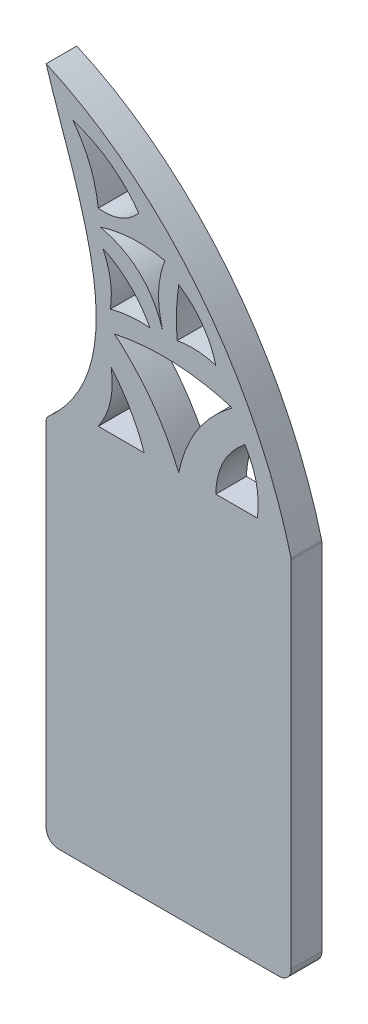
ISO-10303-21;
HEADER;
FILE_DESCRIPTION(('STEP AP214'),'2;1');
FILE_NAME('part.step','',(''),(''),'','','');
FILE_SCHEMA(('AUTOMOTIVE_DESIGN { 1 0 10303 214 1 1 1 1 }'));
ENDSEC;
DATA;
#1=APPLICATION_CONTEXT('core data for automotive mechanical design processes');
#2=APPLICATION_PROTOCOL_DEFINITION('international standard','automotive_design',2000,#1);
#3=PRODUCT_CONTEXT('',#1,'mechanical');
#4=PRODUCT('Part','Part','',(#3));
#5=PRODUCT_RELATED_PRODUCT_CATEGORY('part','',(#4));
#6=PRODUCT_DEFINITION_FORMATION('','',#4);
#7=PRODUCT_DEFINITION_CONTEXT('part definition',#1,'design');
#8=PRODUCT_DEFINITION('design','',#6,#7);
#9=PRODUCT_DEFINITION_SHAPE('','',#8);
#10=(LENGTH_UNIT() NAMED_UNIT(*) SI_UNIT(.MILLI.,.METRE.));
#11=(NAMED_UNIT(*) PLANE_ANGLE_UNIT() SI_UNIT($,.RADIAN.));
#12=(NAMED_UNIT(*) SI_UNIT($,.STERADIAN.) SOLID_ANGLE_UNIT());
#13=UNCERTAINTY_MEASURE_WITH_UNIT(LENGTH_MEASURE(1.E-05),#10,'distance_accuracy_value','');
#14=(GEOMETRIC_REPRESENTATION_CONTEXT(3) GLOBAL_UNCERTAINTY_ASSIGNED_CONTEXT((#13)) GLOBAL_UNIT_ASSIGNED_CONTEXT((#10,
#11,#12)) REPRESENTATION_CONTEXT('',''));
#15=CARTESIAN_POINT('',(0.,0.,0.));
#16=DIRECTION('',(0.,0.,1.));
#17=DIRECTION('',(1.,0.,0.));
#18=AXIS2_PLACEMENT_3D('',#15,#16,#17);
#19=CARTESIAN_POINT('',(0.,0.,12.7));
#20=DIRECTION('',(-1.,0.,0.));
#21=DIRECTION('',(0.,0.,1.));
#22=AXIS2_PLACEMENT_3D('',#19,#20,#21);
#23=PLANE('',#22);
#24=DIRECTION('',(0.,1.,0.));
#25=VECTOR('',#24,1.);
#26=CARTESIAN_POINT('',(0.,0.,0.));
#27=LINE('',#26,#25);
#28=CARTESIAN_POINT('',(0.,5.08,0.));
#29=VERTEX_POINT('',#28);
#30=CARTESIAN_POINT('',(0.,151.251284081008,0.));
#31=VERTEX_POINT('',#30);
#32=EDGE_CURVE('E384',#29,#31,#27,.T.);
#33=ORIENTED_EDGE('',*,*,#32,.F.);
#34=DIRECTION('',(0.,0.,-1.));
#35=VECTOR('',#34,1.);
#36=CARTESIAN_POINT('',(0.,5.08,12.7));
#37=LINE('',#36,#35);
#38=CARTESIAN_POINT('',(0.,5.08,12.7));
#39=VERTEX_POINT('',#38);
#40=EDGE_CURVE('E11',#29,#39,#37,.F.);
#41=ORIENTED_EDGE('',*,*,#40,.T.);
#42=DIRECTION('',(0.,1.,0.));
#43=VECTOR('',#42,1.);
#44=CARTESIAN_POINT('',(0.,0.,12.7));
#45=LINE('',#44,#43);
#46=CARTESIAN_POINT('',(0.,151.251284081008,12.7));
#47=VERTEX_POINT('',#46);
#48=EDGE_CURVE('E383',#39,#47,#45,.T.);
#49=ORIENTED_EDGE('',*,*,#48,.T.);
#50=DIRECTION('',(0.,0.,-1.));
#51=VECTOR('',#50,1.);
#52=CARTESIAN_POINT('',(0.,151.251284081008,12.7));
#53=LINE('',#52,#51);
#54=EDGE_CURVE('E357',#47,#31,#53,.T.);
#55=ORIENTED_EDGE('',*,*,#54,.T.);
#56=EDGE_LOOP('',(#33,#41,#49,#55));
#57=FACE_BOUND('',#56,.T.);
#58=ADVANCED_FACE('F45',(#57),#23,.T.);
#59=CARTESIAN_POINT('',(0.,0.,12.7));
#60=DIRECTION('',(0.,1.,0.));
#61=DIRECTION('',(0.,0.,1.));
#62=AXIS2_PLACEMENT_3D('',#59,#60,#61);
#63=PLANE('',#62);
#64=DIRECTION('',(1.,0.,0.));
#65=VECTOR('',#64,1.);
#66=CARTESIAN_POINT('',(0.,0.,0.));
#67=LINE('',#66,#65);
#68=CARTESIAN_POINT('',(5.08,0.,0.));
#69=VERTEX_POINT('',#68);
#70=CARTESIAN_POINT('',(96.52,0.,0.));
#71=VERTEX_POINT('',#70);
#72=EDGE_CURVE('E388',#69,#71,#67,.T.);
#73=ORIENTED_EDGE('',*,*,#72,.T.);
#74=DIRECTION('',(0.,0.,-1.));
#75=VECTOR('',#74,1.);
#76=CARTESIAN_POINT('',(96.52,0.,12.7));
#77=LINE('',#76,#75);
#78=CARTESIAN_POINT('',(96.52,0.,12.7));
#79=VERTEX_POINT('',#78);
#80=EDGE_CURVE('E67',#71,#79,#77,.F.);
#81=ORIENTED_EDGE('',*,*,#80,.T.);
#82=DIRECTION('',(1.,0.,0.));
#83=VECTOR('',#82,1.);
#84=CARTESIAN_POINT('',(0.,0.,12.7));
#85=LINE('',#84,#83);
#86=CARTESIAN_POINT('',(5.08,0.,12.7));
#87=VERTEX_POINT('',#86);
#88=EDGE_CURVE('E397',#87,#79,#85,.T.);
#89=ORIENTED_EDGE('',*,*,#88,.F.);
#90=DIRECTION('',(0.,0.,-1.));
#91=VECTOR('',#90,1.);
#92=CARTESIAN_POINT('',(5.08,0.,0.));
#93=LINE('',#92,#91);
#94=EDGE_CURVE('E342',#87,#69,#93,.T.);
#95=ORIENTED_EDGE('',*,*,#94,.T.);
#96=EDGE_LOOP('',(#73,#81,#89,#95));
#97=FACE_BOUND('',#96,.T.);
#98=ADVANCED_FACE('F309',(#97),#63,.F.);
#99=CARTESIAN_POINT('',(101.6,0.,12.7));
#100=DIRECTION('',(-1.,0.,0.));
#101=DIRECTION('',(0.,0.,1.));
#102=AXIS2_PLACEMENT_3D('',#99,#100,#101);
#103=PLANE('',#102);
#104=DIRECTION('',(0.,1.,0.));
#105=VECTOR('',#104,1.);
#106=CARTESIAN_POINT('',(101.6,0.,12.7));
#107=LINE('',#106,#105);
#108=CARTESIAN_POINT('',(101.6,5.08,12.7));
#109=VERTEX_POINT('',#108);
#110=CARTESIAN_POINT('',(101.6,152.077820816032,12.7));
#111=VERTEX_POINT('',#110);
#112=EDGE_CURVE('E387',#109,#111,#107,.T.);
#113=ORIENTED_EDGE('',*,*,#112,.F.);
#114=DIRECTION('',(0.,0.,-1.));
#115=VECTOR('',#114,1.);
#116=CARTESIAN_POINT('',(101.6,5.08,12.7));
#117=LINE('',#116,#115);
#118=CARTESIAN_POINT('',(101.6,5.08,0.));
#119=VERTEX_POINT('',#118);
#120=EDGE_CURVE('E333',#109,#119,#117,.T.);
#121=ORIENTED_EDGE('',*,*,#120,.T.);
#122=DIRECTION('',(0.,1.,0.));
#123=VECTOR('',#122,1.);
#124=CARTESIAN_POINT('',(101.6,0.,0.));
#125=LINE('',#124,#123);
#126=CARTESIAN_POINT('',(101.6,152.077820816032,0.));
#127=VERTEX_POINT('',#126);
#128=EDGE_CURVE('E391',#119,#127,#125,.T.);
#129=ORIENTED_EDGE('',*,*,#128,.T.);
#130=DIRECTION('',(0.,0.,1.));
#131=VECTOR('',#130,1.);
#132=CARTESIAN_POINT('',(101.6,152.077820816032,12.7));
#133=LINE('',#132,#131);
#134=EDGE_CURVE('E368',#127,#111,#133,.T.);
#135=ORIENTED_EDGE('',*,*,#134,.T.);
#136=EDGE_LOOP('',(#113,#121,#129,#135));
#137=FACE_BOUND('',#136,.T.);
#138=ADVANCED_FACE('F301',(#137),#103,.F.);
#139=CARTESIAN_POINT('',(0.,0.,12.7));
#140=DIRECTION('',(0.,0.,1.));
#141=DIRECTION('',(1.,0.,0.));
#142=AXIS2_PLACEMENT_3D('',#139,#140,#141);
#143=PLANE('',#142);
#144=ORIENTED_EDGE('',*,*,#88,.T.);
#145=CARTESIAN_POINT('',(96.52,5.08,12.7));
#146=DIRECTION('',(0.,0.,1.));
#147=DIRECTION('',(1.,0.,0.));
#148=AXIS2_PLACEMENT_3D('',#145,#146,#147);
#149=CIRCLE('',#148,5.08);
#150=EDGE_CURVE('E54',#79,#109,#149,.T.);
#151=ORIENTED_EDGE('',*,*,#150,.T.);
#152=ORIENTED_EDGE('',*,*,#112,.T.);
#153=CARTESIAN_POINT('',(99.06,152.077820816032,12.7));
#154=DIRECTION('',(0.,0.,1.));
#155=DIRECTION('',(1.,0.,0.));
#156=AXIS2_PLACEMENT_3D('',#153,#154,#155);
#157=CIRCLE('',#156,2.54);
#158=CARTESIAN_POINT('',(101.519048921032,152.713964199217,12.7));
#159=VERTEX_POINT('',#158);
#160=EDGE_CURVE('E361',#111,#159,#157,.T.);
#161=ORIENTED_EDGE('',*,*,#160,.T.);
#162=CARTESIAN_POINT('',(0.,279.4,12.7));
#163=CARTESIAN_POINT('',(51.286050257495,256.550041835225,12.7));
#164=CARTESIAN_POINT('',(87.8368923823486,205.957944637487,12.7));
#165=CARTESIAN_POINT('',(101.6,152.4,12.7));
#166=B_SPLINE_CURVE_WITH_KNOTS('',3,(#162,#163,#164,#165),.UNSPECIFIED.,.F.,.F.,(4,4),(0.,1.),.UNSPECIFIED.);
#167=CARTESIAN_POINT('',(0.,279.4,12.7));
#168=VERTEX_POINT('',#167);
#169=EDGE_CURVE('E797',#168,#159,#166,.T.);
#170=ORIENTED_EDGE('',*,*,#169,.F.);
#171=CARTESIAN_POINT('',(0.,152.4,12.7));
#172=CARTESIAN_POINT('',(39.7901112765311,186.839065643264,12.7));
#173=CARTESIAN_POINT('',(12.3097562496038,238.845497072906,12.7));
#174=CARTESIAN_POINT('',(0.,279.4,12.7));
#175=B_SPLINE_CURVE_WITH_KNOTS('',3,(#171,#172,#173,#174),.UNSPECIFIED.,.F.,.F.,(4,4),(0.,1.),.UNSPECIFIED.);
#176=CARTESIAN_POINT('',(0.847696562527892,153.145408964832,12.7));
#177=VERTEX_POINT('',#176);
#178=EDGE_CURVE('E807',#177,#168,#175,.T.);
#179=ORIENTED_EDGE('',*,*,#178,.F.);
#180=CARTESIAN_POINT('',(2.54,151.251284081008,12.7));
#181=DIRECTION('',(0.,0.,1.));
#182=DIRECTION('',(1.,0.,0.));
#183=AXIS2_PLACEMENT_3D('',#180,#181,#182);
#184=CIRCLE('',#183,2.54);
#185=EDGE_CURVE('E364',#177,#47,#184,.T.);
#186=ORIENTED_EDGE('',*,*,#185,.T.);
#187=ORIENTED_EDGE('',*,*,#48,.F.);
#188=CARTESIAN_POINT('',(5.08,5.08,12.7));
#189=DIRECTION('',(0.,0.,1.));
#190=DIRECTION('',(1.,0.,0.));
#191=AXIS2_PLACEMENT_3D('',#188,#189,#190);
#192=CIRCLE('',#191,5.08);
#193=EDGE_CURVE('E336',#39,#87,#192,.T.);
#194=ORIENTED_EDGE('',*,*,#193,.T.);
#195=EDGE_LOOP('',(#144,#151,#152,#161,#170,#179,#186,#187,#194));
#196=FACE_BOUND('',#195,.T.);
#197=CARTESIAN_POINT('',(49.2258384870738,233.315766273676,12.7));
#198=CARTESIAN_POINT('',(35.6412289440212,236.267866948693,12.7));
#199=CARTESIAN_POINT('',(22.3756152670284,231.937259722309,12.7));
#200=B_SPLINE_CURVE_WITH_KNOTS('',2,(#197,#198,#199),.UNSPECIFIED.,.F.,.F.,(3,3),(0.,1.),.UNSPECIFIED.);
#201=CARTESIAN_POINT('',(49.2258384870738,233.315766273676,12.7));
#202=VERTEX_POINT('',#201);
#203=CARTESIAN_POINT('',(22.3756152670284,231.937259722309,12.7));
#204=VERTEX_POINT('',#203);
#205=EDGE_CURVE('E247',#202,#204,#200,.T.);
#206=ORIENTED_EDGE('',*,*,#205,.F.);
#207=CARTESIAN_POINT('',(48.4003507205885,207.535437600744,12.7));
#208=CARTESIAN_POINT('',(44.3935689433076,220.734513873405,12.7));
#209=CARTESIAN_POINT('',(49.2258384870738,233.315766273676,12.7));
#210=B_SPLINE_CURVE_WITH_KNOTS('',2,(#207,#208,#209),.UNSPECIFIED.,.F.,.F.,(3,3),(0.,1.),.UNSPECIFIED.);
#211=CARTESIAN_POINT('',(48.4003507205885,207.535437600744,12.7));
#212=VERTEX_POINT('',#211);
#213=EDGE_CURVE('E262',#212,#202,#210,.T.);
#214=ORIENTED_EDGE('',*,*,#213,.F.);
#215=CARTESIAN_POINT('',(48.4003507205885,207.535437600744,12.7));
#216=CARTESIAN_POINT('',(42.0541709012612,227.566198030611,12.7));
#217=CARTESIAN_POINT('',(22.3756152670284,231.937259722309,12.7));
#218=B_SPLINE_CURVE_WITH_KNOTS('',2,(#215,#216,#217),.UNSPECIFIED.,.F.,.F.,(3,3),(0.,1.),.UNSPECIFIED.);
#219=EDGE_CURVE('E264',#212,#204,#218,.T.);
#220=ORIENTED_EDGE('',*,*,#219,.T.);
#221=EDGE_LOOP('',(#206,#214,#220));
#222=FACE_BOUND('',#221,.T.);
#223=CARTESIAN_POINT('',(43.0534809797926,206.088034939823,12.7));
#224=CARTESIAN_POINT('',(36.2397899942018,218.912660539888,12.7));
#225=CARTESIAN_POINT('',(23.5160663721444,224.861937296205,12.7));
#226=B_SPLINE_CURVE_WITH_KNOTS('',2,(#223,#224,#225),.UNSPECIFIED.,.F.,.F.,(3,3),(0.,1.),.UNSPECIFIED.);
#227=CARTESIAN_POINT('',(43.0534809797926,206.088034939823,12.7));
#228=VERTEX_POINT('',#227);
#229=CARTESIAN_POINT('',(23.5160663721444,224.861937296205,12.7));
#230=VERTEX_POINT('',#229);
#231=EDGE_CURVE('E273',#228,#230,#226,.T.);
#232=ORIENTED_EDGE('',*,*,#231,.F.);
#233=CARTESIAN_POINT('',(26.6057281170054,204.582177714214,12.7));
#234=CARTESIAN_POINT('',(34.7004326090841,206.792891753804,12.7));
#235=CARTESIAN_POINT('',(43.0534809797926,206.088034939823,12.7));
#236=B_SPLINE_CURVE_WITH_KNOTS('',2,(#233,#234,#235),.UNSPECIFIED.,.F.,.F.,(3,3),(0.,1.),.UNSPECIFIED.);
#237=CARTESIAN_POINT('',(26.6057281170054,204.582177714214,12.7));
#238=VERTEX_POINT('',#237);
#239=EDGE_CURVE('E1122',#238,#228,#236,.T.);
#240=ORIENTED_EDGE('',*,*,#239,.F.);
#241=CARTESIAN_POINT('',(23.5160663721444,224.861937296205,12.7));
#242=CARTESIAN_POINT('',(28.2352954071151,215.219272619894,12.7));
#243=CARTESIAN_POINT('',(26.6057281170054,204.582177714214,12.7));
#244=B_SPLINE_CURVE_WITH_KNOTS('',2,(#241,#242,#243),.UNSPECIFIED.,.F.,.F.,(3,3),(0.,1.),.UNSPECIFIED.);
#245=EDGE_CURVE('E1128',#230,#238,#244,.T.);
#246=ORIENTED_EDGE('',*,*,#245,.F.);
#247=EDGE_LOOP('',(#232,#240,#246));
#248=FACE_BOUND('',#247,.T.);
#249=CARTESIAN_POINT('',(82.3960896551855,183.8137177803,12.7));
#250=CARTESIAN_POINT('',(70.6713648996861,174.663598783607,12.7));
#251=CARTESIAN_POINT('',(70.3277731701593,160.02,12.7));
#252=B_SPLINE_CURVE_WITH_KNOTS('',2,(#249,#250,#251),.UNSPECIFIED.,.F.,.F.,(3,3),(0.,1.),.UNSPECIFIED.);
#253=CARTESIAN_POINT('',(82.3960896551855,183.8137177803,12.7));
#254=VERTEX_POINT('',#253);
#255=CARTESIAN_POINT('',(70.3277731701593,160.02,12.7));
#256=VERTEX_POINT('',#255);
#257=EDGE_CURVE('E841',#254,#256,#252,.T.);
#258=ORIENTED_EDGE('',*,*,#257,.F.);
#259=CARTESIAN_POINT('',(82.3960896551855,183.8137177803,12.7));
#260=CARTESIAN_POINT('',(89.3395503674179,172.773814042826,12.7));
#261=CARTESIAN_POINT('',(87.546521436446,160.02,12.7));
#262=B_SPLINE_CURVE_WITH_KNOTS('',2,(#259,#260,#261),.UNSPECIFIED.,.F.,.F.,(3,3),(0.,1.),.UNSPECIFIED.);
#263=CARTESIAN_POINT('',(87.546521436446,160.02,12.7));
#264=VERTEX_POINT('',#263);
#265=EDGE_CURVE('E835',#254,#264,#262,.T.);
#266=ORIENTED_EDGE('',*,*,#265,.T.);
#267=DIRECTION('',(1.,0.,0.));
#268=VECTOR('',#267,1.);
#269=CARTESIAN_POINT('',(0.,160.02,12.7));
#270=LINE('',#269,#268);
#271=EDGE_CURVE('E840',#256,#264,#270,.T.);
#272=ORIENTED_EDGE('',*,*,#271,.F.);
#273=EDGE_LOOP('',(#258,#266,#272));
#274=FACE_BOUND('',#273,.T.);
#275=CARTESIAN_POINT('',(26.9804663757679,183.813742110307,12.7));
#276=CARTESIAN_POINT('',(28.9587756049128,170.83754360767,12.7));
#277=CARTESIAN_POINT('',(21.602944742717,160.02,12.7));
#278=B_SPLINE_CURVE_WITH_KNOTS('',2,(#275,#276,#277),.UNSPECIFIED.,.F.,.F.,(3,3),(0.,1.),.UNSPECIFIED.);
#279=CARTESIAN_POINT('',(26.9804663757679,183.813742110307,12.7));
#280=VERTEX_POINT('',#279);
#281=CARTESIAN_POINT('',(21.602944742717,160.02,12.7));
#282=VERTEX_POINT('',#281);
#283=EDGE_CURVE('E787',#280,#282,#278,.T.);
#284=ORIENTED_EDGE('',*,*,#283,.F.);
#285=CARTESIAN_POINT('',(26.9804663757679,183.813742110307,12.7));
#286=CARTESIAN_POINT('',(36.1384728498924,173.175056715144,12.7));
#287=CARTESIAN_POINT('',(40.6766417755855,160.02,12.7));
#288=B_SPLINE_CURVE_WITH_KNOTS('',2,(#285,#286,#287),.UNSPECIFIED.,.F.,.F.,(3,3),(0.,1.),.UNSPECIFIED.);
#289=CARTESIAN_POINT('',(40.6766417755855,160.02,12.7));
#290=VERTEX_POINT('',#289);
#291=EDGE_CURVE('E781',#280,#290,#288,.T.);
#292=ORIENTED_EDGE('',*,*,#291,.T.);
#293=DIRECTION('',(-1.,0.,0.));
#294=VECTOR('',#293,1.);
#295=CARTESIAN_POINT('',(0.,160.02,12.7));
#296=LINE('',#295,#294);
#297=EDGE_CURVE('E761',#290,#282,#296,.T.);
#298=ORIENTED_EDGE('',*,*,#297,.T.);
#299=EDGE_LOOP('',(#284,#292,#298));
#300=FACE_BOUND('',#299,.T.);
#301=CARTESIAN_POINT('',(54.9770830803954,160.02,12.7));
#302=CARTESIAN_POINT('',(46.0834758399413,181.547553160455,12.7));
#303=CARTESIAN_POINT('',(28.3421369029203,196.52980248231,12.7));
#304=B_SPLINE_CURVE_WITH_KNOTS('',2,(#301,#302,#303),.UNSPECIFIED.,.F.,.F.,(3,3),(0.,1.),.UNSPECIFIED.);
#305=CARTESIAN_POINT('',(54.9770830803954,160.02,12.7));
#306=VERTEX_POINT('',#305);
#307=CARTESIAN_POINT('',(28.3421369029203,196.52980248231,12.7));
#308=VERTEX_POINT('',#307);
#309=EDGE_CURVE('E751',#306,#308,#304,.T.);
#310=ORIENTED_EDGE('',*,*,#309,.T.);
#311=CARTESIAN_POINT('',(28.3421369029203,196.52980248231,12.7));
#312=CARTESIAN_POINT('',(53.0178150021792,201.732288520624,12.7));
#313=CARTESIAN_POINT('',(77.1872044953657,194.363538627742,12.7));
#314=B_SPLINE_CURVE_WITH_KNOTS('',2,(#311,#312,#313),.UNSPECIFIED.,.F.,.F.,(3,3),(0.,1.),.UNSPECIFIED.);
#315=CARTESIAN_POINT('',(77.1872044953657,194.363538627742,12.7));
#316=VERTEX_POINT('',#315);
#317=EDGE_CURVE('E742',#308,#316,#314,.T.);
#318=ORIENTED_EDGE('',*,*,#317,.T.);
#319=CARTESIAN_POINT('',(54.9770830803954,160.02,12.7));
#320=CARTESIAN_POINT('',(59.3747288950181,181.400643158016,12.7));
#321=CARTESIAN_POINT('',(77.1872044953657,194.363538627742,12.7));
#322=B_SPLINE_CURVE_WITH_KNOTS('',2,(#319,#320,#321),.UNSPECIFIED.,.F.,.F.,(3,3),(0.,1.),.UNSPECIFIED.);
#323=EDGE_CURVE('E736',#306,#316,#322,.T.);
#324=ORIENTED_EDGE('',*,*,#323,.F.);
#325=EDGE_LOOP('',(#310,#318,#324));
#326=FACE_BOUND('',#325,.T.);
#327=CARTESIAN_POINT('',(70.3282595613759,206.27745757837,12.7));
#328=CARTESIAN_POINT('',(62.3615769619994,208.669014940846,12.7));
#329=CARTESIAN_POINT('',(54.287141361752,207.109917469007,12.7));
#330=B_SPLINE_CURVE_WITH_KNOTS('',2,(#327,#328,#329),.UNSPECIFIED.,.F.,.F.,(3,3),(0.,1.),.UNSPECIFIED.);
#331=CARTESIAN_POINT('',(70.3282595613759,206.27745757837,12.7));
#332=VERTEX_POINT('',#331);
#333=CARTESIAN_POINT('',(54.287141361752,207.109917469007,12.7));
#334=VERTEX_POINT('',#333);
#335=EDGE_CURVE('E712',#332,#334,#330,.T.);
#336=ORIENTED_EDGE('',*,*,#335,.T.);
#337=CARTESIAN_POINT('',(54.287141361752,207.109917469007,12.7));
#338=CARTESIAN_POINT('',(53.4820968113887,217.391663166995,12.7));
#339=CARTESIAN_POINT('',(54.9770830803954,227.557269011986,12.7));
#340=B_SPLINE_CURVE_WITH_KNOTS('',2,(#337,#338,#339),.UNSPECIFIED.,.F.,.F.,(3,3),(0.,1.),.UNSPECIFIED.);
#341=CARTESIAN_POINT('',(54.9770830803954,227.557269011986,12.7));
#342=VERTEX_POINT('',#341);
#343=EDGE_CURVE('E703',#334,#342,#340,.T.);
#344=ORIENTED_EDGE('',*,*,#343,.T.);
#345=CARTESIAN_POINT('',(54.9770830803954,227.557269011986,12.7));
#346=CARTESIAN_POINT('',(66.6458597542174,219.852180833507,12.7));
#347=CARTESIAN_POINT('',(70.3282595613759,206.27745757837,12.7));
#348=B_SPLINE_CURVE_WITH_KNOTS('',2,(#345,#346,#347),.UNSPECIFIED.,.F.,.F.,(3,3),(0.,1.),.UNSPECIFIED.);
#349=EDGE_CURVE('E694',#342,#332,#348,.T.);
#350=ORIENTED_EDGE('',*,*,#349,.T.);
#351=EDGE_LOOP('',(#336,#344,#350));
#352=FACE_BOUND('',#351,.T.);
#353=CARTESIAN_POINT('',(21.602944742717,238.323137826184,12.7));
#354=CARTESIAN_POINT('',(19.9519756703058,252.974545224531,12.7));
#355=CARTESIAN_POINT('',(11.0947377675254,264.601494060694,12.7));
#356=B_SPLINE_CURVE_WITH_KNOTS('',2,(#353,#354,#355),.UNSPECIFIED.,.F.,.F.,(3,3),(0.,1.),.UNSPECIFIED.);
#357=CARTESIAN_POINT('',(21.602944742717,238.323137826184,12.7));
#358=VERTEX_POINT('',#357);
#359=CARTESIAN_POINT('',(11.0947377675254,264.601494060694,12.7));
#360=VERTEX_POINT('',#359);
#361=EDGE_CURVE('E688',#358,#360,#356,.T.);
#362=ORIENTED_EDGE('',*,*,#361,.T.);
#363=CARTESIAN_POINT('',(11.0947377675254,264.601494060694,12.7));
#364=CARTESIAN_POINT('',(28.0538351864922,259.295838114787,12.7));
#365=CARTESIAN_POINT('',(38.4122672823243,244.949944055659,12.7));
#366=B_SPLINE_CURVE_WITH_KNOTS('',2,(#363,#364,#365),.UNSPECIFIED.,.F.,.F.,(3,3),(0.,1.),.UNSPECIFIED.);
#367=CARTESIAN_POINT('',(38.4122672823243,244.949944055659,12.7));
#368=VERTEX_POINT('',#367);
#369=EDGE_CURVE('E666',#360,#368,#366,.T.);
#370=ORIENTED_EDGE('',*,*,#369,.T.);
#371=CARTESIAN_POINT('',(21.602944742717,238.323137826184,12.7));
#372=CARTESIAN_POINT('',(31.864782778685,237.284469605231,12.7));
#373=CARTESIAN_POINT('',(38.4122672823243,244.949944055659,12.7));
#374=B_SPLINE_CURVE_WITH_KNOTS('',2,(#371,#372,#373),.UNSPECIFIED.,.F.,.F.,(3,3),(0.,1.),.UNSPECIFIED.);
#375=EDGE_CURVE('E407',#358,#368,#374,.T.);
#376=ORIENTED_EDGE('',*,*,#375,.F.);
#377=EDGE_LOOP('',(#362,#370,#376));
#378=FACE_BOUND('',#377,.T.);
#379=ADVANCED_FACE('F260',(#196,#222,#248,#274,#300,#326,#352,#378),#143,.T.);
#380=CARTESIAN_POINT('',(0.,0.,0.));
#381=DIRECTION('',(0.,0.,1.));
#382=DIRECTION('',(1.,0.,0.));
#383=AXIS2_PLACEMENT_3D('',#380,#381,#382);
#384=PLANE('',#383);
#385=ORIENTED_EDGE('',*,*,#128,.F.);
#386=CARTESIAN_POINT('',(96.52,5.08,0.));
#387=DIRECTION('',(0.,0.,1.));
#388=DIRECTION('',(1.,0.,0.));
#389=AXIS2_PLACEMENT_3D('',#386,#387,#388);
#390=CIRCLE('',#389,5.08);
#391=EDGE_CURVE('E346',#119,#71,#390,.F.);
#392=ORIENTED_EDGE('',*,*,#391,.T.);
#393=ORIENTED_EDGE('',*,*,#72,.F.);
#394=CARTESIAN_POINT('',(5.08,5.08,0.));
#395=DIRECTION('',(0.,0.,1.));
#396=DIRECTION('',(1.,0.,0.));
#397=AXIS2_PLACEMENT_3D('',#394,#395,#396);
#398=CIRCLE('',#397,5.08);
#399=EDGE_CURVE('E349',#69,#29,#398,.F.);
#400=ORIENTED_EDGE('',*,*,#399,.T.);
#401=ORIENTED_EDGE('',*,*,#32,.T.);
#402=CARTESIAN_POINT('',(2.54,151.251284081008,0.));
#403=DIRECTION('',(0.,0.,1.));
#404=DIRECTION('',(1.,0.,0.));
#405=AXIS2_PLACEMENT_3D('',#402,#403,#404);
#406=CIRCLE('',#405,2.54);
#407=CARTESIAN_POINT('',(0.847696562527875,153.145408964832,0.));
#408=VERTEX_POINT('',#407);
#409=EDGE_CURVE('E376',#31,#408,#406,.F.);
#410=ORIENTED_EDGE('',*,*,#409,.T.);
#411=CARTESIAN_POINT('',(0.,152.4,0.));
#412=CARTESIAN_POINT('',(39.7901112765311,186.839065643264,0.));
#413=CARTESIAN_POINT('',(12.3097562496038,238.845497072906,0.));
#414=CARTESIAN_POINT('',(0.,279.4,0.));
#415=B_SPLINE_CURVE_WITH_KNOTS('',3,(#411,#412,#413,#414),.UNSPECIFIED.,.F.,.F.,(4,4),(0.,1.),.UNSPECIFIED.);
#416=CARTESIAN_POINT('',(0.,279.4,0.));
#417=VERTEX_POINT('',#416);
#418=EDGE_CURVE('E576',#408,#417,#415,.T.);
#419=ORIENTED_EDGE('',*,*,#418,.T.);
#420=CARTESIAN_POINT('',(0.,279.4,0.));
#421=CARTESIAN_POINT('',(51.286050257495,256.550041835225,0.));
#422=CARTESIAN_POINT('',(87.8368923823486,205.957944637487,0.));
#423=CARTESIAN_POINT('',(101.6,152.4,0.));
#424=B_SPLINE_CURVE_WITH_KNOTS('',3,(#420,#421,#422,#423),.UNSPECIFIED.,.F.,.F.,(4,4),(0.,1.),.UNSPECIFIED.);
#425=CARTESIAN_POINT('',(101.519048921032,152.713964199217,0.));
#426=VERTEX_POINT('',#425);
#427=EDGE_CURVE('E567',#417,#426,#424,.T.);
#428=ORIENTED_EDGE('',*,*,#427,.T.);
#429=CARTESIAN_POINT('',(99.06,152.077820816032,0.));
#430=DIRECTION('',(0.,0.,1.));
#431=DIRECTION('',(1.,0.,0.));
#432=AXIS2_PLACEMENT_3D('',#429,#430,#431);
#433=CIRCLE('',#432,2.54);
#434=EDGE_CURVE('E372',#426,#127,#433,.F.);
#435=ORIENTED_EDGE('',*,*,#434,.T.);
#436=EDGE_LOOP('',(#385,#392,#393,#400,#401,#410,#419,#428,#435));
#437=FACE_BOUND('',#436,.T.);
#438=CARTESIAN_POINT('',(49.2258384870738,233.315766273676,0.));
#439=CARTESIAN_POINT('',(35.6412289440212,236.267866948693,0.));
#440=CARTESIAN_POINT('',(22.3756152670284,231.937259722309,0.));
#441=B_SPLINE_CURVE_WITH_KNOTS('',2,(#438,#439,#440),.UNSPECIFIED.,.F.,.F.,(3,3),(0.,1.),.UNSPECIFIED.);
#442=CARTESIAN_POINT('',(49.2258384870738,233.315766273676,0.));
#443=VERTEX_POINT('',#442);
#444=CARTESIAN_POINT('',(22.3756152670284,231.937259722309,0.));
#445=VERTEX_POINT('',#444);
#446=EDGE_CURVE('E249',#443,#445,#441,.T.);
#447=ORIENTED_EDGE('',*,*,#446,.T.);
#448=CARTESIAN_POINT('',(48.4003507205885,207.535437600744,0.));
#449=CARTESIAN_POINT('',(42.0541709012612,227.566198030611,0.));
#450=CARTESIAN_POINT('',(22.3756152670284,231.937259722309,0.));
#451=B_SPLINE_CURVE_WITH_KNOTS('',2,(#448,#449,#450),.UNSPECIFIED.,.F.,.F.,(3,3),(0.,1.),.UNSPECIFIED.);
#452=CARTESIAN_POINT('',(48.4003507205885,207.535437600744,0.));
#453=VERTEX_POINT('',#452);
#454=EDGE_CURVE('E633',#453,#445,#451,.T.);
#455=ORIENTED_EDGE('',*,*,#454,.F.);
#456=CARTESIAN_POINT('',(48.4003507205885,207.535437600744,0.));
#457=CARTESIAN_POINT('',(44.3935689433076,220.734513873405,0.));
#458=CARTESIAN_POINT('',(49.2258384870738,233.315766273676,0.));
#459=B_SPLINE_CURVE_WITH_KNOTS('',2,(#456,#457,#458),.UNSPECIFIED.,.F.,.F.,(3,3),(0.,1.),.UNSPECIFIED.);
#460=EDGE_CURVE('E642',#453,#443,#459,.T.);
#461=ORIENTED_EDGE('',*,*,#460,.T.);
#462=EDGE_LOOP('',(#447,#455,#461));
#463=FACE_BOUND('',#462,.T.);
#464=CARTESIAN_POINT('',(43.0534809797926,206.088034939823,0.));
#465=CARTESIAN_POINT('',(36.2397899942018,218.912660539888,0.));
#466=CARTESIAN_POINT('',(23.5160663721444,224.861937296205,0.));
#467=B_SPLINE_CURVE_WITH_KNOTS('',2,(#464,#465,#466),.UNSPECIFIED.,.F.,.F.,(3,3),(0.,1.),.UNSPECIFIED.);
#468=CARTESIAN_POINT('',(43.0534809797926,206.088034939823,0.));
#469=VERTEX_POINT('',#468);
#470=CARTESIAN_POINT('',(23.5160663721444,224.861937296205,0.));
#471=VERTEX_POINT('',#470);
#472=EDGE_CURVE('E624',#469,#471,#467,.T.);
#473=ORIENTED_EDGE('',*,*,#472,.T.);
#474=CARTESIAN_POINT('',(23.5160663721444,224.861937296205,0.));
#475=CARTESIAN_POINT('',(28.2352954071151,215.219272619894,0.));
#476=CARTESIAN_POINT('',(26.6057281170054,204.582177714214,0.));
#477=B_SPLINE_CURVE_WITH_KNOTS('',2,(#474,#475,#476),.UNSPECIFIED.,.F.,.F.,(3,3),(0.,1.),.UNSPECIFIED.);
#478=CARTESIAN_POINT('',(26.6057281170054,204.582177714214,0.));
#479=VERTEX_POINT('',#478);
#480=EDGE_CURVE('E606',#471,#479,#477,.T.);
#481=ORIENTED_EDGE('',*,*,#480,.T.);
#482=CARTESIAN_POINT('',(26.6057281170054,204.582177714214,0.));
#483=CARTESIAN_POINT('',(34.7004326090841,206.792891753804,0.));
#484=CARTESIAN_POINT('',(43.0534809797926,206.088034939823,0.));
#485=B_SPLINE_CURVE_WITH_KNOTS('',2,(#482,#483,#484),.UNSPECIFIED.,.F.,.F.,(3,3),(0.,1.),.UNSPECIFIED.);
#486=EDGE_CURVE('E615',#479,#469,#485,.T.);
#487=ORIENTED_EDGE('',*,*,#486,.T.);
#488=EDGE_LOOP('',(#473,#481,#487));
#489=FACE_BOUND('',#488,.T.);
#490=CARTESIAN_POINT('',(82.3960896551855,183.8137177803,0.));
#491=CARTESIAN_POINT('',(70.6713648996861,174.663598783607,0.));
#492=CARTESIAN_POINT('',(70.3277731701593,160.02,0.));
#493=B_SPLINE_CURVE_WITH_KNOTS('',2,(#490,#491,#492),.UNSPECIFIED.,.F.,.F.,(3,3),(0.,1.),.UNSPECIFIED.);
#494=CARTESIAN_POINT('',(82.3960896551855,183.8137177803,0.));
#495=VERTEX_POINT('',#494);
#496=CARTESIAN_POINT('',(70.3277731701593,160.02,0.));
#497=VERTEX_POINT('',#496);
#498=EDGE_CURVE('E597',#495,#497,#493,.T.);
#499=ORIENTED_EDGE('',*,*,#498,.T.);
#500=DIRECTION('',(1.,0.,0.));
#501=VECTOR('',#500,1.);
#502=CARTESIAN_POINT('',(0.,160.02,0.));
#503=LINE('',#502,#501);
#504=CARTESIAN_POINT('',(87.546521436446,160.02,0.));
#505=VERTEX_POINT('',#504);
#506=EDGE_CURVE('E584',#497,#505,#503,.T.);
#507=ORIENTED_EDGE('',*,*,#506,.T.);
#508=CARTESIAN_POINT('',(82.3960896551855,183.8137177803,0.));
#509=CARTESIAN_POINT('',(89.3395503674179,172.773814042826,0.));
#510=CARTESIAN_POINT('',(87.546521436446,160.02,0.));
#511=B_SPLINE_CURVE_WITH_KNOTS('',2,(#508,#509,#510),.UNSPECIFIED.,.F.,.F.,(3,3),(0.,1.),.UNSPECIFIED.);
#512=EDGE_CURVE('E591',#495,#505,#511,.T.);
#513=ORIENTED_EDGE('',*,*,#512,.F.);
#514=EDGE_LOOP('',(#499,#507,#513));
#515=FACE_BOUND('',#514,.T.);
#516=CARTESIAN_POINT('',(26.9804663757679,183.813742110307,0.));
#517=CARTESIAN_POINT('',(28.9587756049128,170.83754360767,0.));
#518=CARTESIAN_POINT('',(21.602944742717,160.02,0.));
#519=B_SPLINE_CURVE_WITH_KNOTS('',2,(#516,#517,#518),.UNSPECIFIED.,.F.,.F.,(3,3),(0.,1.),.UNSPECIFIED.);
#520=CARTESIAN_POINT('',(26.9804663757679,183.813742110307,0.));
#521=VERTEX_POINT('',#520);
#522=CARTESIAN_POINT('',(21.602944742717,160.02,0.));
#523=VERTEX_POINT('',#522);
#524=EDGE_CURVE('E558',#521,#523,#519,.T.);
#525=ORIENTED_EDGE('',*,*,#524,.T.);
#526=DIRECTION('',(-1.,0.,0.));
#527=VECTOR('',#526,1.);
#528=CARTESIAN_POINT('',(0.,160.02,0.));
#529=LINE('',#528,#527);
#530=CARTESIAN_POINT('',(40.6766417755855,160.02,0.));
#531=VERTEX_POINT('',#530);
#532=EDGE_CURVE('E545',#531,#523,#529,.T.);
#533=ORIENTED_EDGE('',*,*,#532,.F.);
#534=CARTESIAN_POINT('',(26.9804663757679,183.813742110307,0.));
#535=CARTESIAN_POINT('',(36.1384728498924,173.175056715144,0.));
#536=CARTESIAN_POINT('',(40.6766417755855,160.02,0.));
#537=B_SPLINE_CURVE_WITH_KNOTS('',2,(#534,#535,#536),.UNSPECIFIED.,.F.,.F.,(3,3),(0.,1.),.UNSPECIFIED.);
#538=EDGE_CURVE('E552',#521,#531,#537,.T.);
#539=ORIENTED_EDGE('',*,*,#538,.F.);
#540=EDGE_LOOP('',(#525,#533,#539));
#541=FACE_BOUND('',#540,.T.);
#542=CARTESIAN_POINT('',(54.9770830803954,160.02,0.));
#543=CARTESIAN_POINT('',(46.0834758399413,181.547553160455,0.));
#544=CARTESIAN_POINT('',(28.3421369029203,196.52980248231,0.));
#545=B_SPLINE_CURVE_WITH_KNOTS('',2,(#542,#543,#544),.UNSPECIFIED.,.F.,.F.,(3,3),(0.,1.),.UNSPECIFIED.);
#546=CARTESIAN_POINT('',(54.9770830803954,160.02,0.));
#547=VERTEX_POINT('',#546);
#548=CARTESIAN_POINT('',(28.3421369029203,196.52980248231,0.));
#549=VERTEX_POINT('',#548);
#550=EDGE_CURVE('E536',#547,#549,#545,.T.);
#551=ORIENTED_EDGE('',*,*,#550,.F.);
#552=CARTESIAN_POINT('',(54.9770830803954,160.02,0.));
#553=CARTESIAN_POINT('',(59.3747288950181,181.400643158016,0.));
#554=CARTESIAN_POINT('',(77.1872044953657,194.363538627742,0.));
#555=B_SPLINE_CURVE_WITH_KNOTS('',2,(#552,#553,#554),.UNSPECIFIED.,.F.,.F.,(3,3),(0.,1.),.UNSPECIFIED.);
#556=CARTESIAN_POINT('',(77.1872044953657,194.363538627742,0.));
#557=VERTEX_POINT('',#556);
#558=EDGE_CURVE('E518',#547,#557,#555,.T.);
#559=ORIENTED_EDGE('',*,*,#558,.T.);
#560=CARTESIAN_POINT('',(28.3421369029203,196.52980248231,0.));
#561=CARTESIAN_POINT('',(53.0178150021792,201.732288520624,0.));
#562=CARTESIAN_POINT('',(77.1872044953657,194.363538627742,0.));
#563=B_SPLINE_CURVE_WITH_KNOTS('',2,(#560,#561,#562),.UNSPECIFIED.,.F.,.F.,(3,3),(0.,1.),.UNSPECIFIED.);
#564=EDGE_CURVE('E527',#549,#557,#563,.T.);
#565=ORIENTED_EDGE('',*,*,#564,.F.);
#566=EDGE_LOOP('',(#551,#559,#565));
#567=FACE_BOUND('',#566,.T.);
#568=CARTESIAN_POINT('',(70.3282595613759,206.27745757837,0.));
#569=CARTESIAN_POINT('',(62.3615769619994,208.669014940846,0.));
#570=CARTESIAN_POINT('',(54.287141361752,207.109917469007,0.));
#571=B_SPLINE_CURVE_WITH_KNOTS('',2,(#568,#569,#570),.UNSPECIFIED.,.F.,.F.,(3,3),(0.,1.),.UNSPECIFIED.);
#572=CARTESIAN_POINT('',(70.3282595613759,206.27745757837,0.));
#573=VERTEX_POINT('',#572);
#574=CARTESIAN_POINT('',(54.287141361752,207.109917469007,0.));
#575=VERTEX_POINT('',#574);
#576=EDGE_CURVE('E509',#573,#575,#571,.T.);
#577=ORIENTED_EDGE('',*,*,#576,.F.);
#578=CARTESIAN_POINT('',(54.9770830803954,227.557269011986,0.));
#579=CARTESIAN_POINT('',(66.6458597542174,219.852180833507,0.));
#580=CARTESIAN_POINT('',(70.3282595613759,206.27745757837,0.));
#581=B_SPLINE_CURVE_WITH_KNOTS('',2,(#578,#579,#580),.UNSPECIFIED.,.F.,.F.,(3,3),(0.,1.),.UNSPECIFIED.);
#582=CARTESIAN_POINT('',(54.9770830803954,227.557269011986,0.));
#583=VERTEX_POINT('',#582);
#584=EDGE_CURVE('E493',#583,#573,#581,.T.);
#585=ORIENTED_EDGE('',*,*,#584,.F.);
#586=CARTESIAN_POINT('',(54.287141361752,207.109917469007,0.));
#587=CARTESIAN_POINT('',(53.4820968113887,217.391663166995,0.));
#588=CARTESIAN_POINT('',(54.9770830803954,227.557269011986,0.));
#589=B_SPLINE_CURVE_WITH_KNOTS('',2,(#586,#587,#588),.UNSPECIFIED.,.F.,.F.,(3,3),(0.,1.),.UNSPECIFIED.);
#590=EDGE_CURVE('E501',#575,#583,#589,.T.);
#591=ORIENTED_EDGE('',*,*,#590,.F.);
#592=EDGE_LOOP('',(#577,#585,#591));
#593=FACE_BOUND('',#592,.T.);
#594=CARTESIAN_POINT('',(21.602944742717,238.323137826184,0.));
#595=CARTESIAN_POINT('',(19.9519756703058,252.974545224531,0.));
#596=CARTESIAN_POINT('',(11.0947377675254,264.601494060694,0.));
#597=B_SPLINE_CURVE_WITH_KNOTS('',2,(#594,#595,#596),.UNSPECIFIED.,.F.,.F.,(3,3),(0.,1.),.UNSPECIFIED.);
#598=CARTESIAN_POINT('',(21.602944742717,238.323137826184,0.));
#599=VERTEX_POINT('',#598);
#600=CARTESIAN_POINT('',(11.0947377675254,264.601494060694,0.));
#601=VERTEX_POINT('',#600);
#602=EDGE_CURVE('E484',#599,#601,#597,.T.);
#603=ORIENTED_EDGE('',*,*,#602,.F.);
#604=CARTESIAN_POINT('',(21.602944742717,238.323137826184,0.));
#605=CARTESIAN_POINT('',(31.864782778685,237.284469605231,0.));
#606=CARTESIAN_POINT('',(38.4122672823243,244.949944055659,0.));
#607=B_SPLINE_CURVE_WITH_KNOTS('',2,(#604,#605,#606),.UNSPECIFIED.,.F.,.F.,(3,3),(0.,1.),.UNSPECIFIED.);
#608=CARTESIAN_POINT('',(38.4122672823243,244.949944055659,0.));
#609=VERTEX_POINT('',#608);
#610=EDGE_CURVE('E267',#599,#609,#607,.T.);
#611=ORIENTED_EDGE('',*,*,#610,.T.);
#612=CARTESIAN_POINT('',(11.0947377675254,264.601494060694,0.));
#613=CARTESIAN_POINT('',(28.0538351864922,259.295838114787,0.));
#614=CARTESIAN_POINT('',(38.4122672823243,244.949944055659,0.));
#615=B_SPLINE_CURVE_WITH_KNOTS('',2,(#612,#613,#614),.UNSPECIFIED.,.F.,.F.,(3,3),(0.,1.),.UNSPECIFIED.);
#616=EDGE_CURVE('E475',#601,#609,#615,.T.);
#617=ORIENTED_EDGE('',*,*,#616,.F.);
#618=EDGE_LOOP('',(#603,#611,#617));
#619=FACE_BOUND('',#618,.T.);
#620=ADVANCED_FACE('F300',(#437,#463,#489,#515,#541,#567,#593,#619),#384,.F.);
#621=DIRECTION('',(0.,0.,-1.));
#622=VECTOR('',#621,1.);
#623=SURFACE_OF_LINEAR_EXTRUSION('',#356,#622);
#624=ORIENTED_EDGE('',*,*,#602,.T.);
#625=DIRECTION('',(0.,0.,-1.));
#626=VECTOR('',#625,1.);
#627=CARTESIAN_POINT('',(11.0947377675254,264.601494060694,12.7));
#628=LINE('',#627,#626);
#629=EDGE_CURVE('E394',#360,#601,#628,.T.);
#630=ORIENTED_EDGE('',*,*,#629,.F.);
#631=ORIENTED_EDGE('',*,*,#361,.F.);
#632=DIRECTION('',(0.,0.,-1.));
#633=VECTOR('',#632,1.);
#634=CARTESIAN_POINT('',(21.602944742717,238.323137826184,12.7));
#635=LINE('',#634,#633);
#636=EDGE_CURVE('E454',#358,#599,#635,.T.);
#637=ORIENTED_EDGE('',*,*,#636,.T.);
#638=EDGE_LOOP('',(#624,#630,#631,#637));
#639=FACE_BOUND('',#638,.T.);
#640=ADVANCED_FACE('F305',(#639),#623,.F.);
#641=DIRECTION('',(0.,0.,-1.));
#642=VECTOR('',#641,1.);
#643=SURFACE_OF_LINEAR_EXTRUSION('',#366,#642);
#644=ORIENTED_EDGE('',*,*,#616,.T.);
#645=DIRECTION('',(0.,0.,-1.));
#646=VECTOR('',#645,1.);
#647=CARTESIAN_POINT('',(38.4122672823243,244.949944055659,12.7));
#648=LINE('',#647,#646);
#649=EDGE_CURVE('E465',#368,#609,#648,.T.);
#650=ORIENTED_EDGE('',*,*,#649,.F.);
#651=ORIENTED_EDGE('',*,*,#369,.F.);
#652=ORIENTED_EDGE('',*,*,#629,.T.);
#653=EDGE_LOOP('',(#644,#650,#651,#652));
#654=FACE_BOUND('',#653,.T.);
#655=ADVANCED_FACE('F678',(#654),#643,.F.);
#656=DIRECTION('',(0.,0.,-1.));
#657=VECTOR('',#656,1.);
#658=SURFACE_OF_LINEAR_EXTRUSION('',#330,#657);
#659=ORIENTED_EDGE('',*,*,#576,.T.);
#660=DIRECTION('',(0.,0.,-1.));
#661=VECTOR('',#660,1.);
#662=CARTESIAN_POINT('',(54.287141361752,207.109917469007,12.7));
#663=LINE('',#662,#661);
#664=EDGE_CURVE('E450',#334,#575,#663,.T.);
#665=ORIENTED_EDGE('',*,*,#664,.F.);
#666=ORIENTED_EDGE('',*,*,#335,.F.);
#667=DIRECTION('',(0.,0.,-1.));
#668=VECTOR('',#667,1.);
#669=CARTESIAN_POINT('',(70.3282595613759,206.27745757837,12.7));
#670=LINE('',#669,#668);
#671=EDGE_CURVE('E444',#332,#573,#670,.T.);
#672=ORIENTED_EDGE('',*,*,#671,.T.);
#673=EDGE_LOOP('',(#659,#665,#666,#672));
#674=FACE_BOUND('',#673,.T.);
#675=ADVANCED_FACE('F681',(#674),#658,.F.);
#676=DIRECTION('',(0.,0.,-1.));
#677=VECTOR('',#676,1.);
#678=SURFACE_OF_LINEAR_EXTRUSION('',#340,#677);
#679=ORIENTED_EDGE('',*,*,#590,.T.);
#680=DIRECTION('',(0.,0.,-1.));
#681=VECTOR('',#680,1.);
#682=CARTESIAN_POINT('',(54.9770830803954,227.557269011986,12.7));
#683=LINE('',#682,#681);
#684=EDGE_CURVE('E455',#342,#583,#683,.T.);
#685=ORIENTED_EDGE('',*,*,#684,.F.);
#686=ORIENTED_EDGE('',*,*,#343,.F.);
#687=ORIENTED_EDGE('',*,*,#664,.T.);
#688=EDGE_LOOP('',(#679,#685,#686,#687));
#689=FACE_BOUND('',#688,.T.);
#690=ADVANCED_FACE('F720',(#689),#678,.F.);
#691=DIRECTION('',(0.,0.,-1.));
#692=VECTOR('',#691,1.);
#693=SURFACE_OF_LINEAR_EXTRUSION('',#304,#692);
#694=ORIENTED_EDGE('',*,*,#550,.T.);
#695=DIRECTION('',(0.,0.,-1.));
#696=VECTOR('',#695,1.);
#697=CARTESIAN_POINT('',(28.3421369029203,196.52980248231,12.7));
#698=LINE('',#697,#696);
#699=EDGE_CURVE('E440',#308,#549,#698,.T.);
#700=ORIENTED_EDGE('',*,*,#699,.F.);
#701=ORIENTED_EDGE('',*,*,#309,.F.);
#702=DIRECTION('',(0.,0.,-1.));
#703=VECTOR('',#702,1.);
#704=CARTESIAN_POINT('',(54.9770830803954,160.02,12.7));
#705=LINE('',#704,#703);
#706=EDGE_CURVE('E433',#306,#547,#705,.T.);
#707=ORIENTED_EDGE('',*,*,#706,.T.);
#708=EDGE_LOOP('',(#694,#700,#701,#707));
#709=FACE_BOUND('',#708,.T.);
#710=ADVANCED_FACE('F723',(#709),#693,.F.);
#711=DIRECTION('',(0.,0.,-1.));
#712=VECTOR('',#711,1.);
#713=SURFACE_OF_LINEAR_EXTRUSION('',#314,#712);
#714=ORIENTED_EDGE('',*,*,#564,.T.);
#715=DIRECTION('',(0.,0.,-1.));
#716=VECTOR('',#715,1.);
#717=CARTESIAN_POINT('',(77.1872044953657,194.363538627742,12.7));
#718=LINE('',#717,#716);
#719=EDGE_CURVE('E445',#316,#557,#718,.T.);
#720=ORIENTED_EDGE('',*,*,#719,.F.);
#721=ORIENTED_EDGE('',*,*,#317,.F.);
#722=ORIENTED_EDGE('',*,*,#699,.T.);
#723=EDGE_LOOP('',(#714,#720,#721,#722));
#724=FACE_BOUND('',#723,.T.);
#725=ADVANCED_FACE('F733',(#724),#713,.F.);
#726=DIRECTION('',(0.,0.,-1.));
#727=VECTOR('',#726,1.);
#728=SURFACE_OF_LINEAR_EXTRUSION('',#278,#727);
#729=ORIENTED_EDGE('',*,*,#524,.F.);
#730=DIRECTION('',(0.,0.,-1.));
#731=VECTOR('',#730,1.);
#732=CARTESIAN_POINT('',(26.9804663757679,183.813742110307,12.7));
#733=LINE('',#732,#731);
#734=EDGE_CURVE('E430',#280,#521,#733,.T.);
#735=ORIENTED_EDGE('',*,*,#734,.F.);
#736=ORIENTED_EDGE('',*,*,#283,.T.);
#737=DIRECTION('',(0.,0.,-1.));
#738=VECTOR('',#737,1.);
#739=CARTESIAN_POINT('',(21.602944742717,160.02,12.7));
#740=LINE('',#739,#738);
#741=EDGE_CURVE('E429',#282,#523,#740,.T.);
#742=ORIENTED_EDGE('',*,*,#741,.T.);
#743=EDGE_LOOP('',(#729,#735,#736,#742));
#744=FACE_BOUND('',#743,.T.);
#745=ADVANCED_FACE('F777',(#744),#728,.T.);
#746=DIRECTION('',(0.,0.,-1.));
#747=VECTOR('',#746,1.);
#748=SURFACE_OF_LINEAR_EXTRUSION('',#288,#747);
#749=ORIENTED_EDGE('',*,*,#538,.T.);
#750=DIRECTION('',(0.,0.,-1.));
#751=VECTOR('',#750,1.);
#752=CARTESIAN_POINT('',(40.6766417755855,160.02,12.7));
#753=LINE('',#752,#751);
#754=EDGE_CURVE('E434',#290,#531,#753,.T.);
#755=ORIENTED_EDGE('',*,*,#754,.F.);
#756=ORIENTED_EDGE('',*,*,#291,.F.);
#757=ORIENTED_EDGE('',*,*,#734,.T.);
#758=EDGE_LOOP('',(#749,#755,#756,#757));
#759=FACE_BOUND('',#758,.T.);
#760=ADVANCED_FACE('F773',(#759),#748,.F.);
#761=DIRECTION('',(0.,0.,-1.));
#762=VECTOR('',#761,1.);
#763=SURFACE_OF_LINEAR_EXTRUSION('',#175,#762);
#764=ORIENTED_EDGE('',*,*,#418,.F.);
#765=DIRECTION('',(0.,0.,-1.));
#766=VECTOR('',#765,1.);
#767=CARTESIAN_POINT('',(0.847696562528081,153.145408964832,0.));
#768=LINE('',#767,#766);
#769=EDGE_CURVE('E354',#408,#177,#768,.F.);
#770=ORIENTED_EDGE('',*,*,#769,.T.);
#771=ORIENTED_EDGE('',*,*,#178,.T.);
#772=DIRECTION('',(0.,0.,-1.));
#773=VECTOR('',#772,1.);
#774=CARTESIAN_POINT('',(0.,279.4,12.7));
#775=LINE('',#774,#773);
#776=EDGE_CURVE('E420',#168,#417,#775,.T.);
#777=ORIENTED_EDGE('',*,*,#776,.T.);
#778=EDGE_LOOP('',(#764,#770,#771,#777));
#779=FACE_BOUND('',#778,.T.);
#780=ADVANCED_FACE('F776',(#779),#763,.T.);
#781=DIRECTION('',(0.,0.,-1.));
#782=VECTOR('',#781,1.);
#783=SURFACE_OF_LINEAR_EXTRUSION('',#252,#782);
#784=ORIENTED_EDGE('',*,*,#498,.F.);
#785=DIRECTION('',(0.,0.,-1.));
#786=VECTOR('',#785,1.);
#787=CARTESIAN_POINT('',(82.3960896551855,183.8137177803,12.7));
#788=LINE('',#787,#786);
#789=EDGE_CURVE('E417',#254,#495,#788,.T.);
#790=ORIENTED_EDGE('',*,*,#789,.F.);
#791=ORIENTED_EDGE('',*,*,#257,.T.);
#792=DIRECTION('',(0.,0.,-1.));
#793=VECTOR('',#792,1.);
#794=CARTESIAN_POINT('',(70.3277731701593,160.02,12.7));
#795=LINE('',#794,#793);
#796=EDGE_CURVE('E411',#256,#497,#795,.T.);
#797=ORIENTED_EDGE('',*,*,#796,.T.);
#798=EDGE_LOOP('',(#784,#790,#791,#797));
#799=FACE_BOUND('',#798,.T.);
#800=ADVANCED_FACE('F821',(#799),#783,.T.);
#801=DIRECTION('',(0.,0.,-1.));
#802=VECTOR('',#801,1.);
#803=SURFACE_OF_LINEAR_EXTRUSION('',#262,#802);
#804=ORIENTED_EDGE('',*,*,#512,.T.);
#805=DIRECTION('',(0.,0.,-1.));
#806=VECTOR('',#805,1.);
#807=CARTESIAN_POINT('',(87.546521436446,160.02,12.7));
#808=LINE('',#807,#806);
#809=EDGE_CURVE('E421',#264,#505,#808,.T.);
#810=ORIENTED_EDGE('',*,*,#809,.F.);
#811=ORIENTED_EDGE('',*,*,#265,.F.);
#812=ORIENTED_EDGE('',*,*,#789,.T.);
#813=EDGE_LOOP('',(#804,#810,#811,#812));
#814=FACE_BOUND('',#813,.T.);
#815=ADVANCED_FACE('F827',(#814),#803,.F.);
#816=DIRECTION('',(0.,0.,-1.));
#817=VECTOR('',#816,1.);
#818=SURFACE_OF_LINEAR_EXTRUSION('',#226,#817);
#819=ORIENTED_EDGE('',*,*,#472,.F.);
#820=DIRECTION('',(0.,0.,-1.));
#821=VECTOR('',#820,1.);
#822=CARTESIAN_POINT('',(43.0534809797926,206.088034939823,12.7));
#823=LINE('',#822,#821);
#824=EDGE_CURVE('E408',#228,#469,#823,.T.);
#825=ORIENTED_EDGE('',*,*,#824,.F.);
#826=ORIENTED_EDGE('',*,*,#231,.T.);
#827=DIRECTION('',(0.,0.,-1.));
#828=VECTOR('',#827,1.);
#829=CARTESIAN_POINT('',(23.5160663721444,224.861937296205,12.7));
#830=LINE('',#829,#828);
#831=EDGE_CURVE('E255',#230,#471,#830,.T.);
#832=ORIENTED_EDGE('',*,*,#831,.T.);
#833=EDGE_LOOP('',(#819,#825,#826,#832));
#834=FACE_BOUND('',#833,.T.);
#835=ADVANCED_FACE('F831',(#834),#818,.T.);
#836=DIRECTION('',(0.,0.,-1.));
#837=VECTOR('',#836,1.);
#838=SURFACE_OF_LINEAR_EXTRUSION('',#236,#837);
#839=ORIENTED_EDGE('',*,*,#486,.F.);
#840=DIRECTION('',(0.,0.,-1.));
#841=VECTOR('',#840,1.);
#842=CARTESIAN_POINT('',(26.6057281170054,204.582177714214,12.7));
#843=LINE('',#842,#841);
#844=EDGE_CURVE('E412',#238,#479,#843,.T.);
#845=ORIENTED_EDGE('',*,*,#844,.F.);
#846=ORIENTED_EDGE('',*,*,#239,.T.);
#847=ORIENTED_EDGE('',*,*,#824,.T.);
#848=EDGE_LOOP('',(#839,#845,#846,#847));
#849=FACE_BOUND('',#848,.T.);
#850=ADVANCED_FACE('F297',(#849),#838,.T.);
#851=DIRECTION('',(0.,0.,-1.));
#852=VECTOR('',#851,1.);
#853=SURFACE_OF_LINEAR_EXTRUSION('',#200,#852);
#854=ORIENTED_EDGE('',*,*,#446,.F.);
#855=DIRECTION('',(0.,0.,-1.));
#856=VECTOR('',#855,1.);
#857=CARTESIAN_POINT('',(49.2258384870738,233.315766273676,12.7));
#858=LINE('',#857,#856);
#859=EDGE_CURVE('E244',#202,#443,#858,.T.);
#860=ORIENTED_EDGE('',*,*,#859,.F.);
#861=ORIENTED_EDGE('',*,*,#205,.T.);
#862=DIRECTION('',(0.,0.,-1.));
#863=VECTOR('',#862,1.);
#864=CARTESIAN_POINT('',(22.3756152670284,231.937259722309,12.7));
#865=LINE('',#864,#863);
#866=EDGE_CURVE('E404',#204,#445,#865,.T.);
#867=ORIENTED_EDGE('',*,*,#866,.T.);
#868=EDGE_LOOP('',(#854,#860,#861,#867));
#869=FACE_BOUND('',#868,.T.);
#870=ADVANCED_FACE('F246',(#869),#853,.T.);
#871=DIRECTION('',(0.,0.,-1.));
#872=VECTOR('',#871,1.);
#873=SURFACE_OF_LINEAR_EXTRUSION('',#210,#872);
#874=ORIENTED_EDGE('',*,*,#460,.F.);
#875=DIRECTION('',(0.,0.,-1.));
#876=VECTOR('',#875,1.);
#877=CARTESIAN_POINT('',(48.4003507205885,207.535437600744,12.7));
#878=LINE('',#877,#876);
#879=EDGE_CURVE('E256',#212,#453,#878,.T.);
#880=ORIENTED_EDGE('',*,*,#879,.F.);
#881=ORIENTED_EDGE('',*,*,#213,.T.);
#882=ORIENTED_EDGE('',*,*,#859,.T.);
#883=EDGE_LOOP('',(#874,#880,#881,#882));
#884=FACE_BOUND('',#883,.T.);
#885=ADVANCED_FACE('F269',(#884),#873,.T.);
#886=DIRECTION('',(0.,0.,-1.));
#887=VECTOR('',#886,1.);
#888=SURFACE_OF_LINEAR_EXTRUSION('',#348,#887);
#889=ORIENTED_EDGE('',*,*,#584,.T.);
#890=ORIENTED_EDGE('',*,*,#671,.F.);
#891=ORIENTED_EDGE('',*,*,#349,.F.);
#892=ORIENTED_EDGE('',*,*,#684,.T.);
#893=EDGE_LOOP('',(#889,#890,#891,#892));
#894=FACE_BOUND('',#893,.T.);
#895=ADVANCED_FACE('F292',(#894),#888,.F.);
#896=DIRECTION('',(0.,0.,-1.));
#897=VECTOR('',#896,1.);
#898=SURFACE_OF_LINEAR_EXTRUSION('',#322,#897);
#899=ORIENTED_EDGE('',*,*,#558,.F.);
#900=ORIENTED_EDGE('',*,*,#706,.F.);
#901=ORIENTED_EDGE('',*,*,#323,.T.);
#902=ORIENTED_EDGE('',*,*,#719,.T.);
#903=EDGE_LOOP('',(#899,#900,#901,#902));
#904=FACE_BOUND('',#903,.T.);
#905=ADVANCED_FACE('F728',(#904),#898,.T.);
#906=CARTESIAN_POINT('',(0.,160.02,12.7));
#907=DIRECTION('',(0.,-1.,0.));
#908=DIRECTION('',(0.,0.,-1.));
#909=AXIS2_PLACEMENT_3D('',#906,#907,#908);
#910=PLANE('',#909);
#911=ORIENTED_EDGE('',*,*,#532,.T.);
#912=ORIENTED_EDGE('',*,*,#741,.F.);
#913=ORIENTED_EDGE('',*,*,#297,.F.);
#914=ORIENTED_EDGE('',*,*,#754,.T.);
#915=EDGE_LOOP('',(#911,#912,#913,#914));
#916=FACE_BOUND('',#915,.T.);
#917=ADVANCED_FACE('F731',(#916),#910,.F.);
#918=DIRECTION('',(0.,0.,-1.));
#919=VECTOR('',#918,1.);
#920=SURFACE_OF_LINEAR_EXTRUSION('',#166,#919);
#921=ORIENTED_EDGE('',*,*,#169,.T.);
#922=DIRECTION('',(0.,0.,-1.));
#923=VECTOR('',#922,1.);
#924=CARTESIAN_POINT('',(101.519048921034,152.713964199209,12.7));
#925=LINE('',#924,#923);
#926=EDGE_CURVE('E379',#159,#426,#925,.T.);
#927=ORIENTED_EDGE('',*,*,#926,.T.);
#928=ORIENTED_EDGE('',*,*,#427,.F.);
#929=ORIENTED_EDGE('',*,*,#776,.F.);
#930=EDGE_LOOP('',(#921,#927,#928,#929));
#931=FACE_BOUND('',#930,.T.);
#932=ADVANCED_FACE('F771',(#931),#920,.T.);
#933=CARTESIAN_POINT('',(0.,160.02,12.7));
#934=DIRECTION('',(0.,1.,0.));
#935=DIRECTION('',(0.,0.,1.));
#936=AXIS2_PLACEMENT_3D('',#933,#934,#935);
#937=PLANE('',#936);
#938=ORIENTED_EDGE('',*,*,#506,.F.);
#939=ORIENTED_EDGE('',*,*,#796,.F.);
#940=ORIENTED_EDGE('',*,*,#271,.T.);
#941=ORIENTED_EDGE('',*,*,#809,.T.);
#942=EDGE_LOOP('',(#938,#939,#940,#941));
#943=FACE_BOUND('',#942,.T.);
#944=ADVANCED_FACE('F817',(#943),#937,.T.);
#945=DIRECTION('',(0.,0.,-1.));
#946=VECTOR('',#945,1.);
#947=SURFACE_OF_LINEAR_EXTRUSION('',#244,#946);
#948=ORIENTED_EDGE('',*,*,#480,.F.);
#949=ORIENTED_EDGE('',*,*,#831,.F.);
#950=ORIENTED_EDGE('',*,*,#245,.T.);
#951=ORIENTED_EDGE('',*,*,#844,.T.);
#952=EDGE_LOOP('',(#948,#949,#950,#951));
#953=FACE_BOUND('',#952,.T.);
#954=ADVANCED_FACE('F825',(#953),#947,.T.);
#955=DIRECTION('',(0.,0.,-1.));
#956=VECTOR('',#955,1.);
#957=SURFACE_OF_LINEAR_EXTRUSION('',#218,#956);
#958=ORIENTED_EDGE('',*,*,#454,.T.);
#959=ORIENTED_EDGE('',*,*,#866,.F.);
#960=ORIENTED_EDGE('',*,*,#219,.F.);
#961=ORIENTED_EDGE('',*,*,#879,.T.);
#962=EDGE_LOOP('',(#958,#959,#960,#961));
#963=FACE_BOUND('',#962,.T.);
#964=ADVANCED_FACE('F293',(#963),#957,.F.);
#965=DIRECTION('',(0.,0.,-1.));
#966=VECTOR('',#965,1.);
#967=SURFACE_OF_LINEAR_EXTRUSION('',#374,#966);
#968=ORIENTED_EDGE('',*,*,#610,.F.);
#969=ORIENTED_EDGE('',*,*,#636,.F.);
#970=ORIENTED_EDGE('',*,*,#375,.T.);
#971=ORIENTED_EDGE('',*,*,#649,.T.);
#972=EDGE_LOOP('',(#968,#969,#970,#971));
#973=FACE_BOUND('',#972,.T.);
#974=ADVANCED_FACE('F319',(#973),#967,.T.);
#975=CARTESIAN_POINT('',(99.06,152.077820816032,6.35));
#976=DIRECTION('',(0.,0.,-1.));
#977=DIRECTION('',(-1.,0.,0.));
#978=AXIS2_PLACEMENT_3D('',#975,#976,#977);
#979=CYLINDRICAL_SURFACE('',#978,2.54);
#980=ORIENTED_EDGE('',*,*,#160,.F.);
#981=ORIENTED_EDGE('',*,*,#134,.F.);
#982=ORIENTED_EDGE('',*,*,#434,.F.);
#983=ORIENTED_EDGE('',*,*,#926,.F.);
#984=EDGE_LOOP('',(#980,#981,#982,#983));
#985=FACE_BOUND('',#984,.T.);
#986=ADVANCED_FACE('F315',(#985),#979,.T.);
#987=CARTESIAN_POINT('',(2.54,151.251284081008,6.35));
#988=DIRECTION('',(0.,0.,-1.));
#989=DIRECTION('',(-1.,0.,0.));
#990=AXIS2_PLACEMENT_3D('',#987,#988,#989);
#991=CYLINDRICAL_SURFACE('',#990,2.54);
#992=ORIENTED_EDGE('',*,*,#185,.F.);
#993=ORIENTED_EDGE('',*,*,#769,.F.);
#994=ORIENTED_EDGE('',*,*,#409,.F.);
#995=ORIENTED_EDGE('',*,*,#54,.F.);
#996=EDGE_LOOP('',(#992,#993,#994,#995));
#997=FACE_BOUND('',#996,.T.);
#998=ADVANCED_FACE('F318',(#997),#991,.T.);
#999=CARTESIAN_POINT('',(96.52,5.08,12.7));
#1000=DIRECTION('',(0.,0.,-1.));
#1001=DIRECTION('',(-1.,0.,0.));
#1002=AXIS2_PLACEMENT_3D('',#999,#1000,#1001);
#1003=CYLINDRICAL_SURFACE('',#1002,5.08);
#1004=ORIENTED_EDGE('',*,*,#150,.F.);
#1005=ORIENTED_EDGE('',*,*,#80,.F.);
#1006=ORIENTED_EDGE('',*,*,#391,.F.);
#1007=ORIENTED_EDGE('',*,*,#120,.F.);
#1008=EDGE_LOOP('',(#1004,#1005,#1006,#1007));
#1009=FACE_BOUND('',#1008,.T.);
#1010=ADVANCED_FACE('F322',(#1009),#1003,.T.);
#1011=CARTESIAN_POINT('',(5.08,5.08,12.7));
#1012=DIRECTION('',(0.,0.,1.));
#1013=DIRECTION('',(1.,0.,0.));
#1014=AXIS2_PLACEMENT_3D('',#1011,#1012,#1013);
#1015=CYLINDRICAL_SURFACE('',#1014,5.08);
#1016=ORIENTED_EDGE('',*,*,#193,.F.);
#1017=ORIENTED_EDGE('',*,*,#40,.F.);
#1018=ORIENTED_EDGE('',*,*,#399,.F.);
#1019=ORIENTED_EDGE('',*,*,#94,.F.);
#1020=EDGE_LOOP('',(#1016,#1017,#1018,#1019));
#1021=FACE_BOUND('',#1020,.T.);
#1022=ADVANCED_FACE('F47',(#1021),#1015,.T.);
#1023=CLOSED_SHELL('',(#58,#98,#138,#379,#620,#640,#655,#675,#690,#710,#725,#745,#760,#780,#800,
#815,#835,#850,#870,#885,#895,#905,#917,#932,#944,#954,#964,#974,#986,#998,#1010,#1022));
#1024=MANIFOLD_SOLID_BREP('B2',#1023);
#1025=ADVANCED_BREP_SHAPE_REPRESENTATION('',(#18,#1024),#14);
#1026=SHAPE_DEFINITION_REPRESENTATION(#9,#1025);
ENDSEC;
END-ISO-10303-21;
